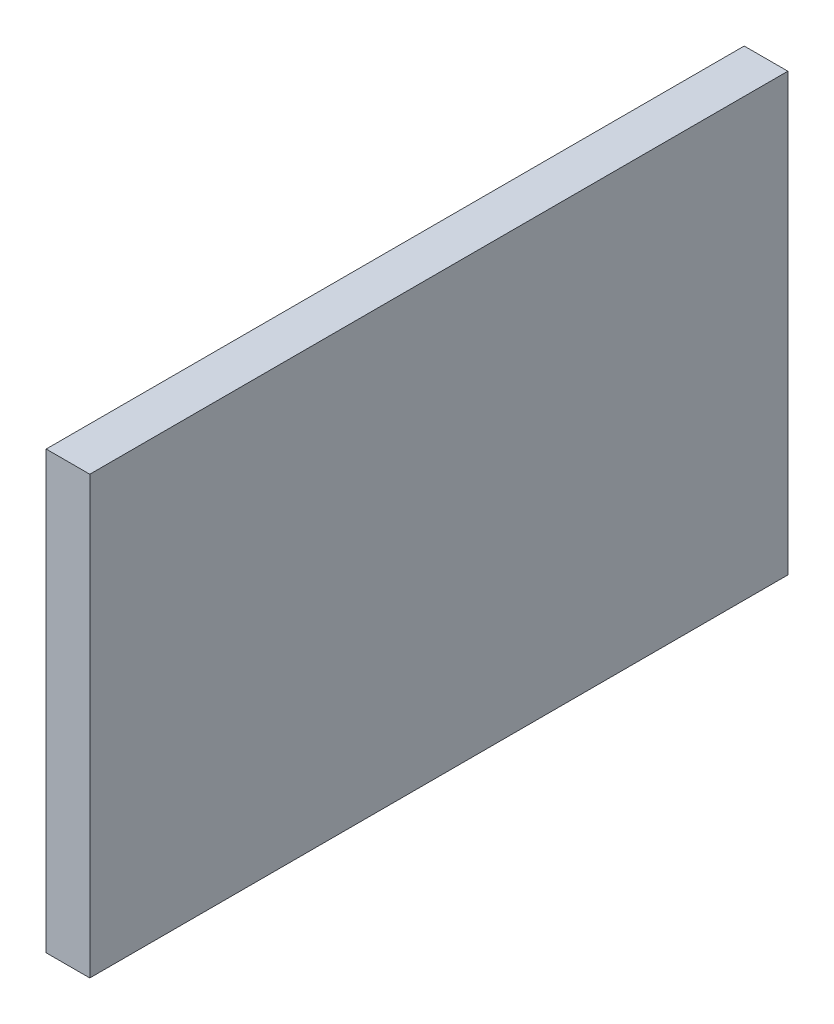
ISO-10303-21;
HEADER;
FILE_DESCRIPTION(('STEP AP214'),'2;1');
FILE_NAME('part.step','',(''),(''),'','','');
FILE_SCHEMA(('AUTOMOTIVE_DESIGN { 1 0 10303 214 1 1 1 1 }'));
ENDSEC;
DATA;
#1=APPLICATION_CONTEXT('core data for automotive mechanical design processes');
#2=APPLICATION_PROTOCOL_DEFINITION('international standard','automotive_design',2000,#1);
#3=PRODUCT_CONTEXT('',#1,'mechanical');
#4=PRODUCT('Part','Part','',(#3));
#5=PRODUCT_RELATED_PRODUCT_CATEGORY('part','',(#4));
#6=PRODUCT_DEFINITION_FORMATION('','',#4);
#7=PRODUCT_DEFINITION_CONTEXT('part definition',#1,'design');
#8=PRODUCT_DEFINITION('design','',#6,#7);
#9=PRODUCT_DEFINITION_SHAPE('','',#8);
#10=(LENGTH_UNIT() NAMED_UNIT(*) SI_UNIT(.MILLI.,.METRE.));
#11=(NAMED_UNIT(*) PLANE_ANGLE_UNIT() SI_UNIT($,.RADIAN.));
#12=(NAMED_UNIT(*) SI_UNIT($,.STERADIAN.) SOLID_ANGLE_UNIT());
#13=UNCERTAINTY_MEASURE_WITH_UNIT(LENGTH_MEASURE(1.E-05),#10,'distance_accuracy_value','');
#14=(GEOMETRIC_REPRESENTATION_CONTEXT(3) GLOBAL_UNCERTAINTY_ASSIGNED_CONTEXT((#13)) GLOBAL_UNIT_ASSIGNED_CONTEXT((#10,
#11,#12)) REPRESENTATION_CONTEXT('',''));
#15=CARTESIAN_POINT('',(0.,0.,0.));
#16=DIRECTION('',(0.,0.,1.));
#17=DIRECTION('',(1.,0.,0.));
#18=AXIS2_PLACEMENT_3D('',#15,#16,#17);
#19=CARTESIAN_POINT('',(100.,2000.,1600.));
#20=DIRECTION('',(-1.,0.,0.));
#21=DIRECTION('',(0.,0.,1.));
#22=AXIS2_PLACEMENT_3D('',#19,#20,#21);
#23=PLANE('',#22);
#24=DIRECTION('',(0.,0.,-1.));
#25=VECTOR('',#24,1.);
#26=CARTESIAN_POINT('',(100.,0.,1600.));
#27=LINE('',#26,#25);
#28=CARTESIAN_POINT('',(100.,0.,1600.));
#29=VERTEX_POINT('',#28);
#30=CARTESIAN_POINT('',(100.,0.,-1600.));
#31=VERTEX_POINT('',#30);
#32=EDGE_CURVE('E111',#29,#31,#27,.T.);
#33=ORIENTED_EDGE('',*,*,#32,.T.);
#34=DIRECTION('',(0.,-1.,0.));
#35=VECTOR('',#34,1.);
#36=CARTESIAN_POINT('',(100.,2000.,-1600.));
#37=LINE('',#36,#35);
#38=CARTESIAN_POINT('',(100.,2000.,-1600.));
#39=VERTEX_POINT('',#38);
#40=EDGE_CURVE('E11',#39,#31,#37,.T.);
#41=ORIENTED_EDGE('',*,*,#40,.F.);
#42=DIRECTION('',(0.,0.,-1.));
#43=VECTOR('',#42,1.);
#44=CARTESIAN_POINT('',(100.,2000.,1600.));
#45=LINE('',#44,#43);
#46=CARTESIAN_POINT('',(100.,2000.,1600.));
#47=VERTEX_POINT('',#46);
#48=EDGE_CURVE('E95',#47,#39,#45,.T.);
#49=ORIENTED_EDGE('',*,*,#48,.F.);
#50=DIRECTION('',(0.,-1.,0.));
#51=VECTOR('',#50,1.);
#52=CARTESIAN_POINT('',(100.,2000.,1600.));
#53=LINE('',#52,#51);
#54=EDGE_CURVE('E107',#47,#29,#53,.T.);
#55=ORIENTED_EDGE('',*,*,#54,.T.);
#56=EDGE_LOOP('',(#33,#41,#49,#55));
#57=FACE_BOUND('',#56,.T.);
#58=ADVANCED_FACE('F43',(#57),#23,.F.);
#59=CARTESIAN_POINT('',(-100.,2000.,-1600.));
#60=DIRECTION('',(0.,0.,1.));
#61=DIRECTION('',(1.,0.,0.));
#62=AXIS2_PLACEMENT_3D('',#59,#60,#61);
#63=PLANE('',#62);
#64=DIRECTION('',(-1.,0.,0.));
#65=VECTOR('',#64,1.);
#66=CARTESIAN_POINT('',(-100.,0.,-1600.));
#67=LINE('',#66,#65);
#68=CARTESIAN_POINT('',(-100.,0.,-1600.));
#69=VERTEX_POINT('',#68);
#70=EDGE_CURVE('E100',#31,#69,#67,.T.);
#71=ORIENTED_EDGE('',*,*,#70,.T.);
#72=DIRECTION('',(0.,-1.,0.));
#73=VECTOR('',#72,1.);
#74=CARTESIAN_POINT('',(-100.,2000.,-1600.));
#75=LINE('',#74,#73);
#76=CARTESIAN_POINT('',(-100.,2000.,-1600.));
#77=VERTEX_POINT('',#76);
#78=EDGE_CURVE('E52',#77,#69,#75,.T.);
#79=ORIENTED_EDGE('',*,*,#78,.F.);
#80=DIRECTION('',(-1.,0.,0.));
#81=VECTOR('',#80,1.);
#82=CARTESIAN_POINT('',(-100.,2000.,-1600.));
#83=LINE('',#82,#81);
#84=EDGE_CURVE('E90',#39,#77,#83,.T.);
#85=ORIENTED_EDGE('',*,*,#84,.F.);
#86=ORIENTED_EDGE('',*,*,#40,.T.);
#87=EDGE_LOOP('',(#71,#79,#85,#86));
#88=FACE_BOUND('',#87,.T.);
#89=ADVANCED_FACE('F99',(#88),#63,.F.);
#90=CARTESIAN_POINT('',(-100.,2000.,1600.));
#91=DIRECTION('',(1.,0.,0.));
#92=DIRECTION('',(0.,0.,-1.));
#93=AXIS2_PLACEMENT_3D('',#90,#91,#92);
#94=PLANE('',#93);
#95=DIRECTION('',(0.,0.,1.));
#96=VECTOR('',#95,1.);
#97=CARTESIAN_POINT('',(-100.,0.,1600.));
#98=LINE('',#97,#96);
#99=CARTESIAN_POINT('',(-100.,0.,1600.));
#100=VERTEX_POINT('',#99);
#101=EDGE_CURVE('E77',#69,#100,#98,.T.);
#102=ORIENTED_EDGE('',*,*,#101,.T.);
#103=DIRECTION('',(0.,-1.,0.));
#104=VECTOR('',#103,1.);
#105=CARTESIAN_POINT('',(-100.,2000.,1600.));
#106=LINE('',#105,#104);
#107=CARTESIAN_POINT('',(-100.,2000.,1600.));
#108=VERTEX_POINT('',#107);
#109=EDGE_CURVE('E102',#108,#100,#106,.T.);
#110=ORIENTED_EDGE('',*,*,#109,.F.);
#111=DIRECTION('',(0.,0.,1.));
#112=VECTOR('',#111,1.);
#113=CARTESIAN_POINT('',(-100.,2000.,1600.));
#114=LINE('',#113,#112);
#115=EDGE_CURVE('E93',#77,#108,#114,.T.);
#116=ORIENTED_EDGE('',*,*,#115,.F.);
#117=ORIENTED_EDGE('',*,*,#78,.T.);
#118=EDGE_LOOP('',(#102,#110,#116,#117));
#119=FACE_BOUND('',#118,.T.);
#120=ADVANCED_FACE('F103',(#119),#94,.F.);
#121=CARTESIAN_POINT('',(-100.,2000.,1600.));
#122=DIRECTION('',(0.,0.,-1.));
#123=DIRECTION('',(-1.,0.,0.));
#124=AXIS2_PLACEMENT_3D('',#121,#122,#123);
#125=PLANE('',#124);
#126=DIRECTION('',(1.,0.,0.));
#127=VECTOR('',#126,1.);
#128=CARTESIAN_POINT('',(-100.,0.,1600.));
#129=LINE('',#128,#127);
#130=EDGE_CURVE('E83',#100,#29,#129,.T.);
#131=ORIENTED_EDGE('',*,*,#130,.T.);
#132=ORIENTED_EDGE('',*,*,#54,.F.);
#133=DIRECTION('',(1.,0.,0.));
#134=VECTOR('',#133,1.);
#135=CARTESIAN_POINT('',(-100.,2000.,1600.));
#136=LINE('',#135,#134);
#137=EDGE_CURVE('E60',#108,#47,#136,.T.);
#138=ORIENTED_EDGE('',*,*,#137,.F.);
#139=ORIENTED_EDGE('',*,*,#109,.T.);
#140=EDGE_LOOP('',(#131,#132,#138,#139));
#141=FACE_BOUND('',#140,.T.);
#142=ADVANCED_FACE('F124',(#141),#125,.F.);
#143=CARTESIAN_POINT('',(0.,2000.,0.));
#144=DIRECTION('',(0.,-1.,0.));
#145=DIRECTION('',(0.,0.,-1.));
#146=AXIS2_PLACEMENT_3D('',#143,#144,#145);
#147=PLANE('',#146);
#148=ORIENTED_EDGE('',*,*,#48,.T.);
#149=ORIENTED_EDGE('',*,*,#84,.T.);
#150=ORIENTED_EDGE('',*,*,#115,.T.);
#151=ORIENTED_EDGE('',*,*,#137,.T.);
#152=EDGE_LOOP('',(#148,#149,#150,#151));
#153=FACE_BOUND('',#152,.T.);
#154=ADVANCED_FACE('F91',(#153),#147,.F.);
#155=CARTESIAN_POINT('',(0.,0.,0.));
#156=DIRECTION('',(0.,-1.,0.));
#157=DIRECTION('',(0.,0.,-1.));
#158=AXIS2_PLACEMENT_3D('',#155,#156,#157);
#159=PLANE('',#158);
#160=ORIENTED_EDGE('',*,*,#32,.F.);
#161=ORIENTED_EDGE('',*,*,#130,.F.);
#162=ORIENTED_EDGE('',*,*,#101,.F.);
#163=ORIENTED_EDGE('',*,*,#70,.F.);
#164=EDGE_LOOP('',(#160,#161,#162,#163));
#165=FACE_BOUND('',#164,.T.);
#166=ADVANCED_FACE('F127',(#165),#159,.T.);
#167=CLOSED_SHELL('',(#58,#89,#120,#142,#154,#166));
#168=MANIFOLD_SOLID_BREP('B2',#167);
#169=ADVANCED_BREP_SHAPE_REPRESENTATION('',(#18,#168),#14);
#170=SHAPE_DEFINITION_REPRESENTATION(#9,#169);
ENDSEC;
END-ISO-10303-21;
